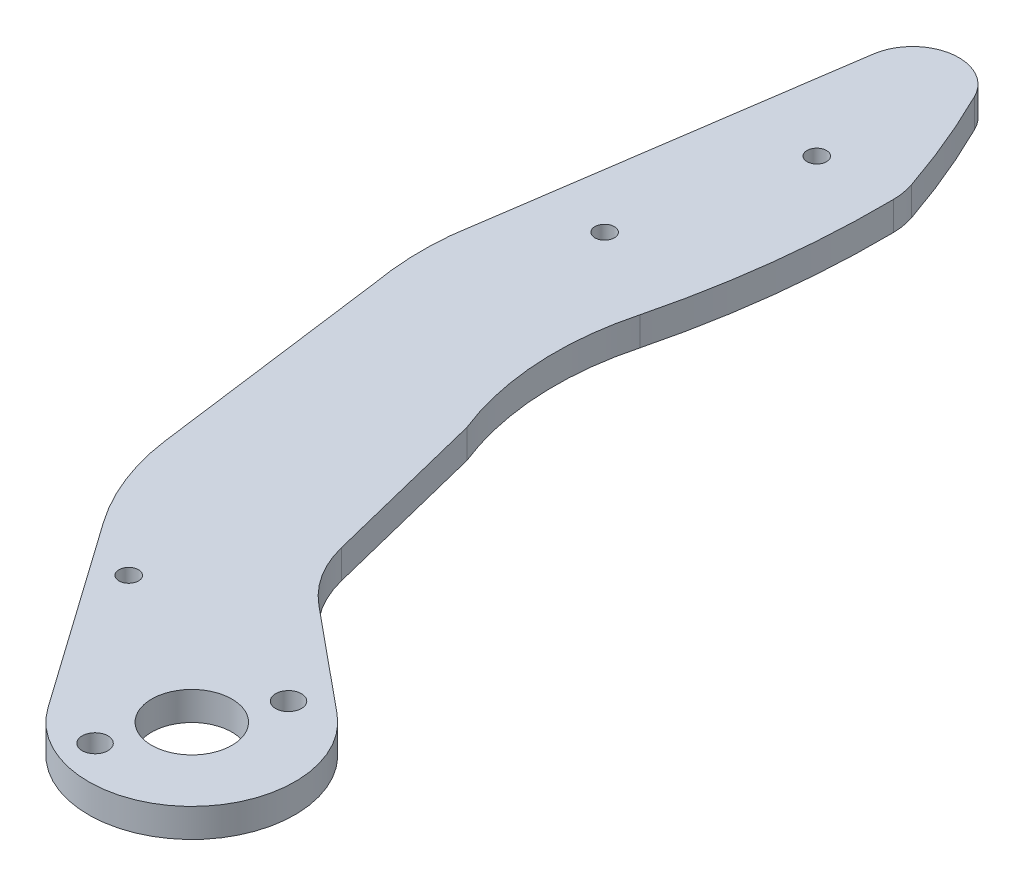
ISO-10303-21;
HEADER;
FILE_DESCRIPTION(('STEP AP214'),'2;1');
FILE_NAME('part.step','',(''),(''),'','','');
FILE_SCHEMA(('AUTOMOTIVE_DESIGN { 1 0 10303 214 1 1 1 1 }'));
ENDSEC;
DATA;
#1=APPLICATION_CONTEXT('core data for automotive mechanical design processes');
#2=APPLICATION_PROTOCOL_DEFINITION('international standard','automotive_design',2000,#1);
#3=PRODUCT_CONTEXT('',#1,'mechanical');
#4=PRODUCT('Part','Part','',(#3));
#5=PRODUCT_RELATED_PRODUCT_CATEGORY('part','',(#4));
#6=PRODUCT_DEFINITION_FORMATION('','',#4);
#7=PRODUCT_DEFINITION_CONTEXT('part definition',#1,'design');
#8=PRODUCT_DEFINITION('design','',#6,#7);
#9=PRODUCT_DEFINITION_SHAPE('','',#8);
#10=(LENGTH_UNIT() NAMED_UNIT(*) SI_UNIT(.MILLI.,.METRE.));
#11=(NAMED_UNIT(*) PLANE_ANGLE_UNIT() SI_UNIT($,.RADIAN.));
#12=(NAMED_UNIT(*) SI_UNIT($,.STERADIAN.) SOLID_ANGLE_UNIT());
#13=UNCERTAINTY_MEASURE_WITH_UNIT(LENGTH_MEASURE(1.E-05),#10,'distance_accuracy_value','');
#14=(GEOMETRIC_REPRESENTATION_CONTEXT(3) GLOBAL_UNCERTAINTY_ASSIGNED_CONTEXT((#13)) GLOBAL_UNIT_ASSIGNED_CONTEXT((#10,
#11,#12)) REPRESENTATION_CONTEXT('',''));
#15=CARTESIAN_POINT('',(0.,0.,0.));
#16=DIRECTION('',(0.,0.,1.));
#17=DIRECTION('',(1.,0.,0.));
#18=AXIS2_PLACEMENT_3D('',#15,#16,#17);
#19=CARTESIAN_POINT('',(0.,5.,0.));
#20=DIRECTION('',(0.,-1.,0.));
#21=DIRECTION('',(0.,0.,-1.));
#22=AXIS2_PLACEMENT_3D('',#19,#20,#21);
#23=PLANE('',#22);
#24=CARTESIAN_POINT('',(-5.25120650732144,5.,11.6184048051987));
#25=DIRECTION('',(0.,1.,0.));
#26=DIRECTION('',(0.,0.,1.));
#27=AXIS2_PLACEMENT_3D('',#24,#25,#26);
#28=CIRCLE('',#27,2.24999999999999);
#29=CARTESIAN_POINT('',(-5.25120650732144,5.,13.8684048051987));
#30=VERTEX_POINT('',#29);
#31=EDGE_CURVE('E312',#30,#30,#28,.T.);
#32=ORIENTED_EDGE('',*,*,#31,.F.);
#33=EDGE_LOOP('',(#32));
#34=FACE_BOUND('',#33,.T.);
#35=CARTESIAN_POINT('',(-31.,5.,-140.));
#36=DIRECTION('',(0.,1.,0.));
#37=DIRECTION('',(0.,0.,1.));
#38=AXIS2_PLACEMENT_3D('',#35,#36,#37);
#39=CIRCLE('',#38,1.7);
#40=CARTESIAN_POINT('',(-31.,5.,-138.3));
#41=VERTEX_POINT('',#40);
#42=EDGE_CURVE('E335',#41,#41,#39,.T.);
#43=ORIENTED_EDGE('',*,*,#42,.F.);
#44=EDGE_LOOP('',(#43));
#45=FACE_BOUND('',#44,.T.);
#46=CARTESIAN_POINT('',(-38.,5.,-110.));
#47=DIRECTION('',(0.,1.,0.));
#48=DIRECTION('',(0.,0.,1.));
#49=AXIS2_PLACEMENT_3D('',#46,#47,#48);
#50=CIRCLE('',#49,1.7);
#51=CARTESIAN_POINT('',(-38.,5.,-108.3));
#52=VERTEX_POINT('',#51);
#53=EDGE_CURVE('E319',#52,#52,#50,.T.);
#54=ORIENTED_EDGE('',*,*,#53,.F.);
#55=EDGE_LOOP('',(#54));
#56=FACE_BOUND('',#55,.T.);
#57=CARTESIAN_POINT('',(0.,5.,0.));
#58=DIRECTION('',(0.,1.,0.));
#59=DIRECTION('',(0.,0.,-1.));
#60=AXIS2_PLACEMENT_3D('',#57,#58,#59);
#61=CIRCLE('',#60,18.);
#62=CARTESIAN_POINT('',(-14.7090417206775,5.,10.3751670665763));
#63=VERTEX_POINT('',#62);
#64=CARTESIAN_POINT('',(11.4464775057828,5.,-13.8916576660098));
#65=VERTEX_POINT('',#64);
#66=EDGE_CURVE('E224',#63,#65,#61,.T.);
#67=ORIENTED_EDGE('',*,*,#66,.T.);
#68=DIRECTION('',(-0.771758759222768,0.,-0.635915416987931));
#69=VECTOR('',#68,1.);
#70=CARTESIAN_POINT('',(11.4464775057828,5.,-13.8916576660098));
#71=LINE('',#70,#69);
#72=CARTESIAN_POINT('',(-6.60695362920451,5.,-28.7673620892809));
#73=VERTEX_POINT('',#72);
#74=EDGE_CURVE('E122',#65,#73,#71,.T.);
#75=ORIENTED_EDGE('',*,*,#74,.T.);
#76=CARTESIAN_POINT('',(6.11135471055411,5.,-44.2025372737363));
#77=DIRECTION('',(0.,-1.,0.));
#78=DIRECTION('',(0.,0.,-1.));
#79=AXIS2_PLACEMENT_3D('',#76,#77,#78);
#80=CIRCLE('',#79,20.);
#81=CARTESIAN_POINT('',(-13.2989437963698,5.,-39.381716609979));
#82=VERTEX_POINT('',#81);
#83=EDGE_CURVE('E270',#73,#82,#80,.T.);
#84=ORIENTED_EDGE('',*,*,#83,.T.);
#85=DIRECTION('',(-0.241041033187863,0.,-0.970514925346193));
#86=VECTOR('',#85,1.);
#87=CARTESIAN_POINT('',(-13.2989437963698,5.,-39.381716609979));
#88=LINE('',#87,#86);
#89=CARTESIAN_POINT('',(-20.5301747920056,5.,-68.4971643703648));
#90=VERTEX_POINT('',#89);
#91=EDGE_CURVE('E290',#82,#90,#88,.T.);
#92=ORIENTED_EDGE('',*,*,#91,.T.);
#93=CARTESIAN_POINT('',(26.9937980567859,5.,-87.4580042567529));
#94=DIRECTION('',(0.,-1.,0.));
#95=DIRECTION('',(0.,0.,1.));
#96=AXIS2_PLACEMENT_3D('',#93,#94,#95);
#97=CIRCLE('',#96,51.1668002178163);
#98=CARTESIAN_POINT('',(-22.4565511628832,5.,-100.599709115054));
#99=VERTEX_POINT('',#98);
#100=EDGE_CURVE('E286',#90,#99,#97,.T.);
#101=ORIENTED_EDGE('',*,*,#100,.T.);
#102=CARTESIAN_POINT('',(-171.2572125516,5.,-138.292363187831));
#103=DIRECTION('',(0.,1.,0.));
#104=DIRECTION('',(0.,0.,1.));
#105=AXIS2_PLACEMENT_3D('',#102,#103,#104);
#106=CIRCLE('',#105,153.500400653449);
#107=CARTESIAN_POINT('',(-17.7680269599981,5.,-140.147870449029));
#108=VERTEX_POINT('',#107);
#109=EDGE_CURVE('E289',#99,#108,#106,.T.);
#110=ORIENTED_EDGE('',*,*,#109,.T.);
#111=CARTESIAN_POINT('',(-30.,5.,-140.));
#112=DIRECTION('',(0.,1.,0.));
#113=DIRECTION('',(0.,0.,1.));
#114=AXIS2_PLACEMENT_3D('',#111,#112,#113);
#115=CIRCLE('',#114,12.2328667989573);
#116=CARTESIAN_POINT('',(-18.4178287610431,5.,-143.93653902718));
#117=VERTEX_POINT('',#116);
#118=EDGE_CURVE('E294',#108,#117,#115,.T.);
#119=ORIENTED_EDGE('',*,*,#118,.T.);
#120=CARTESIAN_POINT('',(-163.753174500954,5.,-94.5400788358876));
#121=DIRECTION('',(0.,1.,0.));
#122=DIRECTION('',(0.,0.,1.));
#123=AXIS2_PLACEMENT_3D('',#120,#121,#122);
#124=CIRCLE('',#123,153.500400653449);
#125=CARTESIAN_POINT('',(-26.2562949035577,5.,-162.782156044517));
#126=VERTEX_POINT('',#125);
#127=EDGE_CURVE('E302',#117,#126,#124,.T.);
#128=ORIENTED_EDGE('',*,*,#127,.T.);
#129=CARTESIAN_POINT('',(-33.4913170526785,5.,-159.191289535021));
#130=DIRECTION('',(0.,1.,0.));
#131=DIRECTION('',(0.,0.,1.));
#132=AXIS2_PLACEMENT_3D('',#129,#130,#131);
#133=CIRCLE('',#132,8.0771200181305);
#134=CARTESIAN_POINT('',(-41.4826176844214,5.,-160.365590178123));
#135=VERTEX_POINT('',#134);
#136=EDGE_CURVE('E305',#126,#135,#133,.T.);
#137=ORIENTED_EDGE('',*,*,#136,.T.);
#138=DIRECTION('',(-0.145386058454699,0.,0.989375001709163));
#139=VECTOR('',#138,1.);
#140=CARTESIAN_POINT('',(-41.4826176844214,5.,-160.365590178123));
#141=LINE('',#140,#139);
#142=CARTESIAN_POINT('',(-50.9327114839769,5.,-96.0562150670269));
#143=VERTEX_POINT('',#142);
#144=EDGE_CURVE('E308',#135,#143,#141,.T.);
#145=ORIENTED_EDGE('',*,*,#144,.T.);
#146=CARTESIAN_POINT('',(0.00716740026227708,5.,-91.2426733575386));
#147=DIRECTION('',(0.,1.,0.));
#148=DIRECTION('',(0.,0.,1.));
#149=AXIS2_PLACEMENT_3D('',#146,#147,#148);
#150=CIRCLE('',#149,51.1668002178164);
#151=CARTESIAN_POINT('',(-50.3834749970696,5.,-82.3643512573803));
#152=VERTEX_POINT('',#151);
#153=EDGE_CURVE('E159',#143,#152,#150,.T.);
#154=ORIENTED_EDGE('',*,*,#153,.T.);
#155=DIRECTION('',(0.130981717678106,0.,0.991384783842325));
#156=VECTOR('',#155,1.);
#157=CARTESIAN_POINT('',(-50.3834749970696,5.,-82.3643512573803));
#158=LINE('',#157,#156);
#159=CARTESIAN_POINT('',(-44.8192942270945,5.,-40.2497397857414));
#160=VERTEX_POINT('',#159);
#161=EDGE_CURVE('E153',#152,#160,#158,.T.);
#162=ORIENTED_EDGE('',*,*,#161,.T.);
#163=CARTESIAN_POINT('',(-5.16390287340153,5.,-45.4890084928656));
#164=DIRECTION('',(0.,1.,0.));
#165=DIRECTION('',(0.,0.,1.));
#166=AXIS2_PLACEMENT_3D('',#163,#164,#165);
#167=CIRCLE('',#166,40.);
#168=CARTESIAN_POINT('',(-37.8506622526848,5.,-22.4330816782516));
#169=VERTEX_POINT('',#168);
#170=EDGE_CURVE('E157',#160,#169,#167,.T.);
#171=ORIENTED_EDGE('',*,*,#170,.T.);
#172=DIRECTION('',(0.576398170365351,0.,0.817168984482081));
#173=VECTOR('',#172,1.);
#174=CARTESIAN_POINT('',(-37.8506622526848,5.,-22.4330816782516));
#175=LINE('',#174,#173);
#176=EDGE_CURVE('E61',#169,#63,#175,.T.);
#177=ORIENTED_EDGE('',*,*,#176,.T.);
#178=EDGE_LOOP('',(#67,#75,#84,#92,#101,#110,#119,#128,#137,#145,#154,#162,#171,#177));
#179=FACE_BOUND('',#178,.T.);
#180=CARTESIAN_POINT('',(0.,5.,0.));
#181=DIRECTION('',(0.,1.,0.));
#182=DIRECTION('',(0.,0.,1.));
#183=AXIS2_PLACEMENT_3D('',#180,#181,#182);
#184=CIRCLE('',#183,7.);
#185=CARTESIAN_POINT('',(0.,5.,7.));
#186=VERTEX_POINT('',#185);
#187=EDGE_CURVE('E188',#186,#186,#184,.T.);
#188=ORIENTED_EDGE('',*,*,#187,.F.);
#189=EDGE_LOOP('',(#188));
#190=FACE_BOUND('',#189,.T.);
#191=CARTESIAN_POINT('',(-27.6732846118374,5.,-16.6790083276029));
#192=DIRECTION('',(0.,1.,0.));
#193=DIRECTION('',(0.,0.,1.));
#194=AXIS2_PLACEMENT_3D('',#191,#192,#193);
#195=CIRCLE('',#194,1.7);
#196=CARTESIAN_POINT('',(-27.6732846118374,5.,-14.9790083276029));
#197=VERTEX_POINT('',#196);
#198=EDGE_CURVE('E347',#197,#197,#195,.T.);
#199=ORIENTED_EDGE('',*,*,#198,.F.);
#200=EDGE_LOOP('',(#199));
#201=FACE_BOUND('',#200,.T.);
#202=CARTESIAN_POINT('',(5.25120650732144,5.,-11.6184048051987));
#203=DIRECTION('',(0.,1.,0.));
#204=DIRECTION('',(0.,0.,1.));
#205=AXIS2_PLACEMENT_3D('',#202,#203,#204);
#206=CIRCLE('',#205,2.24999999999999);
#207=CARTESIAN_POINT('',(5.25120650732144,5.,-9.36840480519874));
#208=VERTEX_POINT('',#207);
#209=EDGE_CURVE('E324',#208,#208,#206,.T.);
#210=ORIENTED_EDGE('',*,*,#209,.F.);
#211=EDGE_LOOP('',(#210));
#212=FACE_BOUND('',#211,.T.);
#213=ADVANCED_FACE('F42',(#34,#45,#56,#179,#190,#201,#212),#23,.F.);
#214=CARTESIAN_POINT('',(0.,0.,0.));
#215=DIRECTION('',(0.,-1.,0.));
#216=DIRECTION('',(0.,0.,-1.));
#217=AXIS2_PLACEMENT_3D('',#214,#215,#216);
#218=PLANE('',#217);
#219=CARTESIAN_POINT('',(-5.25120650732144,0.,11.6184048051987));
#220=DIRECTION('',(0.,-1.,0.));
#221=DIRECTION('',(0.,0.,-1.));
#222=AXIS2_PLACEMENT_3D('',#219,#220,#221);
#223=CIRCLE('',#222,2.24999999999999);
#224=CARTESIAN_POINT('',(-5.25120650732144,0.,9.36840480519874));
#225=VERTEX_POINT('',#224);
#226=EDGE_CURVE('E314',#225,#225,#223,.T.);
#227=ORIENTED_EDGE('',*,*,#226,.F.);
#228=EDGE_LOOP('',(#227));
#229=FACE_BOUND('',#228,.T.);
#230=CARTESIAN_POINT('',(5.25120650732144,0.,-11.6184048051987));
#231=DIRECTION('',(0.,-1.,0.));
#232=DIRECTION('',(0.,0.,-1.));
#233=AXIS2_PLACEMENT_3D('',#230,#231,#232);
#234=CIRCLE('',#233,2.24999999999999);
#235=CARTESIAN_POINT('',(5.25120650732144,0.,-13.8684048051987));
#236=VERTEX_POINT('',#235);
#237=EDGE_CURVE('E46',#236,#236,#234,.T.);
#238=ORIENTED_EDGE('',*,*,#237,.F.);
#239=EDGE_LOOP('',(#238));
#240=FACE_BOUND('',#239,.T.);
#241=CARTESIAN_POINT('',(-31.,0.,-140.));
#242=DIRECTION('',(0.,-1.,0.));
#243=DIRECTION('',(0.,0.,-1.));
#244=AXIS2_PLACEMENT_3D('',#241,#242,#243);
#245=CIRCLE('',#244,1.7);
#246=CARTESIAN_POINT('',(-31.,0.,-141.7));
#247=VERTEX_POINT('',#246);
#248=EDGE_CURVE('E340',#247,#247,#245,.F.);
#249=ORIENTED_EDGE('',*,*,#248,.T.);
#250=EDGE_LOOP('',(#249));
#251=FACE_BOUND('',#250,.T.);
#252=CARTESIAN_POINT('',(-38.,0.,-110.));
#253=DIRECTION('',(0.,-1.,0.));
#254=DIRECTION('',(0.,0.,-1.));
#255=AXIS2_PLACEMENT_3D('',#252,#253,#254);
#256=CIRCLE('',#255,1.7);
#257=CARTESIAN_POINT('',(-38.,0.,-111.7));
#258=VERTEX_POINT('',#257);
#259=EDGE_CURVE('E317',#258,#258,#256,.F.);
#260=ORIENTED_EDGE('',*,*,#259,.T.);
#261=EDGE_LOOP('',(#260));
#262=FACE_BOUND('',#261,.T.);
#263=CARTESIAN_POINT('',(0.,0.,0.));
#264=DIRECTION('',(0.,1.,0.));
#265=DIRECTION('',(0.,0.,1.));
#266=AXIS2_PLACEMENT_3D('',#263,#264,#265);
#267=CIRCLE('',#266,7.);
#268=CARTESIAN_POINT('',(0.,0.,7.));
#269=VERTEX_POINT('',#268);
#270=EDGE_CURVE('E350',#269,#269,#267,.T.);
#271=ORIENTED_EDGE('',*,*,#270,.T.);
#272=EDGE_LOOP('',(#271));
#273=FACE_BOUND('',#272,.T.);
#274=CARTESIAN_POINT('',(0.,0.,0.));
#275=DIRECTION('',(0.,1.,0.));
#276=DIRECTION('',(0.,0.,-1.));
#277=AXIS2_PLACEMENT_3D('',#274,#275,#276);
#278=CIRCLE('',#277,18.);
#279=CARTESIAN_POINT('',(-14.7090417206775,0.,10.3751670665763));
#280=VERTEX_POINT('',#279);
#281=CARTESIAN_POINT('',(11.4464775057828,0.,-13.8916576660098));
#282=VERTEX_POINT('',#281);
#283=EDGE_CURVE('E183',#280,#282,#278,.T.);
#284=ORIENTED_EDGE('',*,*,#283,.F.);
#285=DIRECTION('',(0.576398170365351,0.,0.817168984482081));
#286=VECTOR('',#285,1.);
#287=CARTESIAN_POINT('',(-37.8506622526848,0.,-22.4330816782516));
#288=LINE('',#287,#286);
#289=CARTESIAN_POINT('',(-37.8506622526848,0.,-22.4330816782516));
#290=VERTEX_POINT('',#289);
#291=EDGE_CURVE('E114',#290,#280,#288,.T.);
#292=ORIENTED_EDGE('',*,*,#291,.F.);
#293=CARTESIAN_POINT('',(-5.16390287340153,0.,-45.4890084928656));
#294=DIRECTION('',(0.,1.,0.));
#295=DIRECTION('',(0.,0.,1.));
#296=AXIS2_PLACEMENT_3D('',#293,#294,#295);
#297=CIRCLE('',#296,40.);
#298=CARTESIAN_POINT('',(-44.8192942270945,0.,-40.2497397857414));
#299=VERTEX_POINT('',#298);
#300=EDGE_CURVE('E108',#299,#290,#297,.T.);
#301=ORIENTED_EDGE('',*,*,#300,.F.);
#302=DIRECTION('',(0.130981717678106,0.,0.991384783842325));
#303=VECTOR('',#302,1.);
#304=CARTESIAN_POINT('',(-50.3834749970696,0.,-82.3643512573803));
#305=LINE('',#304,#303);
#306=CARTESIAN_POINT('',(-50.3834749970696,0.,-82.3643512573803));
#307=VERTEX_POINT('',#306);
#308=EDGE_CURVE('E168',#307,#299,#305,.T.);
#309=ORIENTED_EDGE('',*,*,#308,.F.);
#310=CARTESIAN_POINT('',(0.00716740026227708,0.,-91.2426733575386));
#311=DIRECTION('',(0.,1.,0.));
#312=DIRECTION('',(0.,0.,1.));
#313=AXIS2_PLACEMENT_3D('',#310,#311,#312);
#314=CIRCLE('',#313,51.1668002178164);
#315=CARTESIAN_POINT('',(-50.9327114839769,0.,-96.0562150670269));
#316=VERTEX_POINT('',#315);
#317=EDGE_CURVE('E215',#316,#307,#314,.T.);
#318=ORIENTED_EDGE('',*,*,#317,.F.);
#319=DIRECTION('',(-0.145386058454699,0.,0.989375001709163));
#320=VECTOR('',#319,1.);
#321=CARTESIAN_POINT('',(-41.4826176844214,0.,-160.365590178123));
#322=LINE('',#321,#320);
#323=CARTESIAN_POINT('',(-41.4826176844214,0.,-160.365590178123));
#324=VERTEX_POINT('',#323);
#325=EDGE_CURVE('E212',#324,#316,#322,.T.);
#326=ORIENTED_EDGE('',*,*,#325,.F.);
#327=CARTESIAN_POINT('',(-33.4913170526785,0.,-159.191289535021));
#328=DIRECTION('',(0.,1.,0.));
#329=DIRECTION('',(0.,0.,1.));
#330=AXIS2_PLACEMENT_3D('',#327,#328,#329);
#331=CIRCLE('',#330,8.0771200181305);
#332=CARTESIAN_POINT('',(-26.2562949035577,0.,-162.782156044517));
#333=VERTEX_POINT('',#332);
#334=EDGE_CURVE('E209',#333,#324,#331,.T.);
#335=ORIENTED_EDGE('',*,*,#334,.F.);
#336=CARTESIAN_POINT('',(-163.753174500954,0.,-94.5400788358876));
#337=DIRECTION('',(0.,1.,0.));
#338=DIRECTION('',(0.,0.,1.));
#339=AXIS2_PLACEMENT_3D('',#336,#337,#338);
#340=CIRCLE('',#339,153.500400653449);
#341=CARTESIAN_POINT('',(-18.4178287610431,0.,-143.93653902718));
#342=VERTEX_POINT('',#341);
#343=EDGE_CURVE('E206',#342,#333,#340,.T.);
#344=ORIENTED_EDGE('',*,*,#343,.F.);
#345=CARTESIAN_POINT('',(-30.,0.,-140.));
#346=DIRECTION('',(0.,1.,0.));
#347=DIRECTION('',(0.,0.,1.));
#348=AXIS2_PLACEMENT_3D('',#345,#346,#347);
#349=CIRCLE('',#348,12.2328667989573);
#350=CARTESIAN_POINT('',(-17.7680269599981,0.,-140.147870449029));
#351=VERTEX_POINT('',#350);
#352=EDGE_CURVE('E203',#351,#342,#349,.T.);
#353=ORIENTED_EDGE('',*,*,#352,.F.);
#354=CARTESIAN_POINT('',(-171.2572125516,0.,-138.292363187831));
#355=DIRECTION('',(0.,1.,0.));
#356=DIRECTION('',(0.,0.,1.));
#357=AXIS2_PLACEMENT_3D('',#354,#355,#356);
#358=CIRCLE('',#357,153.500400653449);
#359=CARTESIAN_POINT('',(-22.4565511628832,0.,-100.599709115054));
#360=VERTEX_POINT('',#359);
#361=EDGE_CURVE('E200',#360,#351,#358,.T.);
#362=ORIENTED_EDGE('',*,*,#361,.F.);
#363=CARTESIAN_POINT('',(26.9937980567859,0.,-87.4580042567529));
#364=DIRECTION('',(0.,-1.,0.));
#365=DIRECTION('',(0.,0.,1.));
#366=AXIS2_PLACEMENT_3D('',#363,#364,#365);
#367=CIRCLE('',#366,51.1668002178163);
#368=CARTESIAN_POINT('',(-20.5301747920056,0.,-68.4971643703648));
#369=VERTEX_POINT('',#368);
#370=EDGE_CURVE('E197',#369,#360,#367,.T.);
#371=ORIENTED_EDGE('',*,*,#370,.F.);
#372=DIRECTION('',(-0.241041033187863,0.,-0.970514925346193));
#373=VECTOR('',#372,1.);
#374=CARTESIAN_POINT('',(-13.2989437963698,0.,-39.381716609979));
#375=LINE('',#374,#373);
#376=CARTESIAN_POINT('',(-13.2989437963698,0.,-39.381716609979));
#377=VERTEX_POINT('',#376);
#378=EDGE_CURVE('E194',#377,#369,#375,.T.);
#379=ORIENTED_EDGE('',*,*,#378,.F.);
#380=CARTESIAN_POINT('',(6.11135471055411,0.,-44.2025372737363));
#381=DIRECTION('',(0.,-1.,0.));
#382=DIRECTION('',(0.,0.,-1.));
#383=AXIS2_PLACEMENT_3D('',#380,#381,#382);
#384=CIRCLE('',#383,20.);
#385=CARTESIAN_POINT('',(-6.60695362920451,0.,-28.7673620892809));
#386=VERTEX_POINT('',#385);
#387=EDGE_CURVE('E191',#386,#377,#384,.T.);
#388=ORIENTED_EDGE('',*,*,#387,.F.);
#389=DIRECTION('',(-0.771758759222768,0.,-0.635915416987931));
#390=VECTOR('',#389,1.);
#391=CARTESIAN_POINT('',(11.4464775057828,0.,-13.8916576660098));
#392=LINE('',#391,#390);
#393=EDGE_CURVE('E187',#282,#386,#392,.T.);
#394=ORIENTED_EDGE('',*,*,#393,.F.);
#395=EDGE_LOOP('',(#284,#292,#301,#309,#318,#326,#335,#344,#353,#362,#371,#379,#388,#394));
#396=FACE_BOUND('',#395,.T.);
#397=CARTESIAN_POINT('',(-27.6732846118374,0.,-16.6790083276029));
#398=DIRECTION('',(0.,1.,0.));
#399=DIRECTION('',(0.,0.,1.));
#400=AXIS2_PLACEMENT_3D('',#397,#398,#399);
#401=CIRCLE('',#400,1.7);
#402=CARTESIAN_POINT('',(-27.6732846118374,0.,-14.9790083276029));
#403=VERTEX_POINT('',#402);
#404=EDGE_CURVE('E339',#403,#403,#401,.T.);
#405=ORIENTED_EDGE('',*,*,#404,.T.);
#406=EDGE_LOOP('',(#405));
#407=FACE_BOUND('',#406,.T.);
#408=ADVANCED_FACE('F274',(#229,#240,#251,#262,#273,#396,#407),#218,.T.);
#409=CARTESIAN_POINT('',(0.,5.,0.));
#410=DIRECTION('',(0.,-1.,0.));
#411=DIRECTION('',(0.,0.,-1.));
#412=AXIS2_PLACEMENT_3D('',#409,#410,#411);
#413=CYLINDRICAL_SURFACE('',#412,18.);
#414=ORIENTED_EDGE('',*,*,#283,.T.);
#415=DIRECTION('',(0.,-1.,0.));
#416=VECTOR('',#415,1.);
#417=CARTESIAN_POINT('',(11.4464775057828,5.,-13.8916576660098));
#418=LINE('',#417,#416);
#419=EDGE_CURVE('E11',#65,#282,#418,.T.);
#420=ORIENTED_EDGE('',*,*,#419,.F.);
#421=ORIENTED_EDGE('',*,*,#66,.F.);
#422=DIRECTION('',(0.,-1.,0.));
#423=VECTOR('',#422,1.);
#424=CARTESIAN_POINT('',(-14.7090417206775,5.,10.3751670665763));
#425=LINE('',#424,#423);
#426=EDGE_CURVE('E179',#63,#280,#425,.T.);
#427=ORIENTED_EDGE('',*,*,#426,.T.);
#428=EDGE_LOOP('',(#414,#420,#421,#427));
#429=FACE_BOUND('',#428,.T.);
#430=ADVANCED_FACE('F44',(#429),#413,.T.);
#431=CARTESIAN_POINT('',(11.4464775057828,5.,-13.8916576660098));
#432=DIRECTION('',(-0.635915416987931,0.,0.771758759222768));
#433=DIRECTION('',(0.771758759222768,0.,0.635915416987931));
#434=AXIS2_PLACEMENT_3D('',#431,#432,#433);
#435=PLANE('',#434);
#436=ORIENTED_EDGE('',*,*,#393,.T.);
#437=DIRECTION('',(0.,-1.,0.));
#438=VECTOR('',#437,1.);
#439=CARTESIAN_POINT('',(-6.60695362920451,5.,-28.7673620892809));
#440=LINE('',#439,#438);
#441=EDGE_CURVE('E53',#73,#386,#440,.T.);
#442=ORIENTED_EDGE('',*,*,#441,.F.);
#443=ORIENTED_EDGE('',*,*,#74,.F.);
#444=ORIENTED_EDGE('',*,*,#419,.T.);
#445=EDGE_LOOP('',(#436,#442,#443,#444));
#446=FACE_BOUND('',#445,.T.);
#447=ADVANCED_FACE('F363',(#446),#435,.F.);
#448=CARTESIAN_POINT('',(6.11135471055411,5.,-44.2025372737363));
#449=DIRECTION('',(0.,-1.,0.));
#450=DIRECTION('',(0.,0.,-1.));
#451=AXIS2_PLACEMENT_3D('',#448,#449,#450);
#452=CYLINDRICAL_SURFACE('',#451,20.);
#453=ORIENTED_EDGE('',*,*,#387,.T.);
#454=DIRECTION('',(0.,-1.,0.));
#455=VECTOR('',#454,1.);
#456=CARTESIAN_POINT('',(-13.2989437963698,5.,-39.381716609979));
#457=LINE('',#456,#455);
#458=EDGE_CURVE('E258',#82,#377,#457,.T.);
#459=ORIENTED_EDGE('',*,*,#458,.F.);
#460=ORIENTED_EDGE('',*,*,#83,.F.);
#461=ORIENTED_EDGE('',*,*,#441,.T.);
#462=EDGE_LOOP('',(#453,#459,#460,#461));
#463=FACE_BOUND('',#462,.T.);
#464=ADVANCED_FACE('F268',(#463),#452,.F.);
#465=CARTESIAN_POINT('',(-13.2989437963698,5.,-39.381716609979));
#466=DIRECTION('',(-0.970514925346193,0.,0.241041033187863));
#467=DIRECTION('',(0.241041033187863,0.,0.970514925346194));
#468=AXIS2_PLACEMENT_3D('',#465,#466,#467);
#469=PLANE('',#468);
#470=ORIENTED_EDGE('',*,*,#378,.T.);
#471=DIRECTION('',(0.,-1.,0.));
#472=VECTOR('',#471,1.);
#473=CARTESIAN_POINT('',(-20.5301747920056,5.,-68.4971643703648));
#474=LINE('',#473,#472);
#475=EDGE_CURVE('E254',#90,#369,#474,.T.);
#476=ORIENTED_EDGE('',*,*,#475,.F.);
#477=ORIENTED_EDGE('',*,*,#91,.F.);
#478=ORIENTED_EDGE('',*,*,#458,.T.);
#479=EDGE_LOOP('',(#470,#476,#477,#478));
#480=FACE_BOUND('',#479,.T.);
#481=ADVANCED_FACE('F280',(#480),#469,.F.);
#482=CARTESIAN_POINT('',(26.9937980567859,5.,-87.4580042567529));
#483=DIRECTION('',(0.,-1.,0.));
#484=DIRECTION('',(0.,0.,-1.));
#485=AXIS2_PLACEMENT_3D('',#482,#483,#484);
#486=CYLINDRICAL_SURFACE('',#485,51.1668002178163);
#487=ORIENTED_EDGE('',*,*,#370,.T.);
#488=DIRECTION('',(0.,-1.,0.));
#489=VECTOR('',#488,1.);
#490=CARTESIAN_POINT('',(-22.4565511628832,5.,-100.599709115054));
#491=LINE('',#490,#489);
#492=EDGE_CURVE('E250',#99,#360,#491,.T.);
#493=ORIENTED_EDGE('',*,*,#492,.F.);
#494=ORIENTED_EDGE('',*,*,#100,.F.);
#495=ORIENTED_EDGE('',*,*,#475,.T.);
#496=EDGE_LOOP('',(#487,#493,#494,#495));
#497=FACE_BOUND('',#496,.T.);
#498=ADVANCED_FACE('F284',(#497),#486,.F.);
#499=CARTESIAN_POINT('',(-171.2572125516,5.,-138.292363187831));
#500=DIRECTION('',(0.,-1.,0.));
#501=DIRECTION('',(0.,0.,-1.));
#502=AXIS2_PLACEMENT_3D('',#499,#500,#501);
#503=CYLINDRICAL_SURFACE('',#502,153.500400653449);
#504=ORIENTED_EDGE('',*,*,#361,.T.);
#505=DIRECTION('',(0.,-1.,0.));
#506=VECTOR('',#505,1.);
#507=CARTESIAN_POINT('',(-17.7680269599981,5.,-140.147870449029));
#508=LINE('',#507,#506);
#509=EDGE_CURVE('E246',#108,#351,#508,.T.);
#510=ORIENTED_EDGE('',*,*,#509,.F.);
#511=ORIENTED_EDGE('',*,*,#109,.F.);
#512=ORIENTED_EDGE('',*,*,#492,.T.);
#513=EDGE_LOOP('',(#504,#510,#511,#512));
#514=FACE_BOUND('',#513,.T.);
#515=ADVANCED_FACE('F410',(#514),#503,.T.);
#516=CARTESIAN_POINT('',(-30.,5.,-140.));
#517=DIRECTION('',(0.,-1.,0.));
#518=DIRECTION('',(0.,0.,-1.));
#519=AXIS2_PLACEMENT_3D('',#516,#517,#518);
#520=CYLINDRICAL_SURFACE('',#519,12.2328667989573);
#521=ORIENTED_EDGE('',*,*,#352,.T.);
#522=DIRECTION('',(0.,-1.,0.));
#523=VECTOR('',#522,1.);
#524=CARTESIAN_POINT('',(-18.4178287610431,5.,-143.93653902718));
#525=LINE('',#524,#523);
#526=EDGE_CURVE('E242',#117,#342,#525,.T.);
#527=ORIENTED_EDGE('',*,*,#526,.F.);
#528=ORIENTED_EDGE('',*,*,#118,.F.);
#529=ORIENTED_EDGE('',*,*,#509,.T.);
#530=EDGE_LOOP('',(#521,#527,#528,#529));
#531=FACE_BOUND('',#530,.T.);
#532=ADVANCED_FACE('F406',(#531),#520,.T.);
#533=CARTESIAN_POINT('',(-163.753174500954,5.,-94.5400788358876));
#534=DIRECTION('',(0.,-1.,0.));
#535=DIRECTION('',(0.,0.,-1.));
#536=AXIS2_PLACEMENT_3D('',#533,#534,#535);
#537=CYLINDRICAL_SURFACE('',#536,153.500400653449);
#538=ORIENTED_EDGE('',*,*,#343,.T.);
#539=DIRECTION('',(0.,-1.,0.));
#540=VECTOR('',#539,1.);
#541=CARTESIAN_POINT('',(-26.2562949035577,5.,-162.782156044517));
#542=LINE('',#541,#540);
#543=EDGE_CURVE('E238',#126,#333,#542,.T.);
#544=ORIENTED_EDGE('',*,*,#543,.F.);
#545=ORIENTED_EDGE('',*,*,#127,.F.);
#546=ORIENTED_EDGE('',*,*,#526,.T.);
#547=EDGE_LOOP('',(#538,#544,#545,#546));
#548=FACE_BOUND('',#547,.T.);
#549=ADVANCED_FACE('F402',(#548),#537,.T.);
#550=CARTESIAN_POINT('',(-33.4913170526785,5.,-159.191289535021));
#551=DIRECTION('',(0.,-1.,0.));
#552=DIRECTION('',(0.,0.,-1.));
#553=AXIS2_PLACEMENT_3D('',#550,#551,#552);
#554=CYLINDRICAL_SURFACE('',#553,8.0771200181305);
#555=ORIENTED_EDGE('',*,*,#334,.T.);
#556=DIRECTION('',(0.,-1.,0.));
#557=VECTOR('',#556,1.);
#558=CARTESIAN_POINT('',(-41.4826176844214,5.,-160.365590178123));
#559=LINE('',#558,#557);
#560=EDGE_CURVE('E235',#135,#324,#559,.T.);
#561=ORIENTED_EDGE('',*,*,#560,.F.);
#562=ORIENTED_EDGE('',*,*,#136,.F.);
#563=ORIENTED_EDGE('',*,*,#543,.T.);
#564=EDGE_LOOP('',(#555,#561,#562,#563));
#565=FACE_BOUND('',#564,.T.);
#566=ADVANCED_FACE('F398',(#565),#554,.T.);
#567=CARTESIAN_POINT('',(-41.4826176844214,5.,-160.365590178123));
#568=DIRECTION('',(0.989375001709163,0.,0.145386058454699));
#569=DIRECTION('',(0.145386058454699,0.,-0.989375001709163));
#570=AXIS2_PLACEMENT_3D('',#567,#568,#569);
#571=PLANE('',#570);
#572=ORIENTED_EDGE('',*,*,#325,.T.);
#573=DIRECTION('',(0.,-1.,0.));
#574=VECTOR('',#573,1.);
#575=CARTESIAN_POINT('',(-50.9327114839769,5.,-96.0562150670269));
#576=LINE('',#575,#574);
#577=EDGE_CURVE('E231',#143,#316,#576,.T.);
#578=ORIENTED_EDGE('',*,*,#577,.F.);
#579=ORIENTED_EDGE('',*,*,#144,.F.);
#580=ORIENTED_EDGE('',*,*,#560,.T.);
#581=EDGE_LOOP('',(#572,#578,#579,#580));
#582=FACE_BOUND('',#581,.T.);
#583=ADVANCED_FACE('F394',(#582),#571,.F.);
#584=CARTESIAN_POINT('',(0.00716740026227708,5.,-91.2426733575386));
#585=DIRECTION('',(0.,-1.,0.));
#586=DIRECTION('',(0.,0.,-1.));
#587=AXIS2_PLACEMENT_3D('',#584,#585,#586);
#588=CYLINDRICAL_SURFACE('',#587,51.1668002178164);
#589=ORIENTED_EDGE('',*,*,#317,.T.);
#590=DIRECTION('',(0.,-1.,0.));
#591=VECTOR('',#590,1.);
#592=CARTESIAN_POINT('',(-50.3834749970696,5.,-82.3643512573803));
#593=LINE('',#592,#591);
#594=EDGE_CURVE('E170',#152,#307,#593,.T.);
#595=ORIENTED_EDGE('',*,*,#594,.F.);
#596=ORIENTED_EDGE('',*,*,#153,.F.);
#597=ORIENTED_EDGE('',*,*,#577,.T.);
#598=EDGE_LOOP('',(#589,#595,#596,#597));
#599=FACE_BOUND('',#598,.T.);
#600=ADVANCED_FACE('F391',(#599),#588,.T.);
#601=CARTESIAN_POINT('',(-50.3834749970696,5.,-82.3643512573803));
#602=DIRECTION('',(0.991384783842325,0.,-0.130981717678106));
#603=DIRECTION('',(-0.130981717678106,0.,-0.991384783842325));
#604=AXIS2_PLACEMENT_3D('',#601,#602,#603);
#605=PLANE('',#604);
#606=ORIENTED_EDGE('',*,*,#308,.T.);
#607=DIRECTION('',(0.,-1.,0.));
#608=VECTOR('',#607,1.);
#609=CARTESIAN_POINT('',(-44.8192942270945,5.,-40.2497397857414));
#610=LINE('',#609,#608);
#611=EDGE_CURVE('E165',#160,#299,#610,.T.);
#612=ORIENTED_EDGE('',*,*,#611,.F.);
#613=ORIENTED_EDGE('',*,*,#161,.F.);
#614=ORIENTED_EDGE('',*,*,#594,.T.);
#615=EDGE_LOOP('',(#606,#612,#613,#614));
#616=FACE_BOUND('',#615,.T.);
#617=ADVANCED_FACE('F166',(#616),#605,.F.);
#618=CARTESIAN_POINT('',(-5.16390287340153,5.,-45.4890084928656));
#619=DIRECTION('',(0.,-1.,0.));
#620=DIRECTION('',(0.,0.,-1.));
#621=AXIS2_PLACEMENT_3D('',#618,#619,#620);
#622=CYLINDRICAL_SURFACE('',#621,40.);
#623=ORIENTED_EDGE('',*,*,#300,.T.);
#624=DIRECTION('',(0.,-1.,0.));
#625=VECTOR('',#624,1.);
#626=CARTESIAN_POINT('',(-37.8506622526848,5.,-22.4330816782516));
#627=LINE('',#626,#625);
#628=EDGE_CURVE('E171',#169,#290,#627,.T.);
#629=ORIENTED_EDGE('',*,*,#628,.F.);
#630=ORIENTED_EDGE('',*,*,#170,.F.);
#631=ORIENTED_EDGE('',*,*,#611,.T.);
#632=EDGE_LOOP('',(#623,#629,#630,#631));
#633=FACE_BOUND('',#632,.T.);
#634=ADVANCED_FACE('F173',(#633),#622,.T.);
#635=CARTESIAN_POINT('',(-37.8506622526848,5.,-22.4330816782516));
#636=DIRECTION('',(0.817168984482081,0.,-0.576398170365351));
#637=DIRECTION('',(-0.576398170365351,0.,-0.817168984482081));
#638=AXIS2_PLACEMENT_3D('',#635,#636,#637);
#639=PLANE('',#638);
#640=ORIENTED_EDGE('',*,*,#291,.T.);
#641=ORIENTED_EDGE('',*,*,#426,.F.);
#642=ORIENTED_EDGE('',*,*,#176,.F.);
#643=ORIENTED_EDGE('',*,*,#628,.T.);
#644=EDGE_LOOP('',(#640,#641,#642,#643));
#645=FACE_BOUND('',#644,.T.);
#646=ADVANCED_FACE('F384',(#645),#639,.F.);
#647=CARTESIAN_POINT('',(0.,5.,0.));
#648=DIRECTION('',(0.,-1.,0.));
#649=DIRECTION('',(0.,0.,-1.));
#650=AXIS2_PLACEMENT_3D('',#647,#648,#649);
#651=CYLINDRICAL_SURFACE('',#650,7.);
#652=ORIENTED_EDGE('',*,*,#187,.T.);
#653=EDGE_LOOP('',(#652));
#654=FACE_BOUND('',#653,.T.);
#655=ORIENTED_EDGE('',*,*,#270,.F.);
#656=EDGE_LOOP('',(#655));
#657=FACE_BOUND('',#656,.T.);
#658=ADVANCED_FACE('F381',(#654,#657),#651,.F.);
#659=CARTESIAN_POINT('',(-27.6732846118374,5.,-16.6790083276029));
#660=DIRECTION('',(0.,-1.,0.));
#661=DIRECTION('',(0.,0.,-1.));
#662=AXIS2_PLACEMENT_3D('',#659,#660,#661);
#663=CYLINDRICAL_SURFACE('',#662,1.7);
#664=ORIENTED_EDGE('',*,*,#198,.T.);
#665=EDGE_LOOP('',(#664));
#666=FACE_BOUND('',#665,.T.);
#667=ORIENTED_EDGE('',*,*,#404,.F.);
#668=EDGE_LOOP('',(#667));
#669=FACE_BOUND('',#668,.T.);
#670=ADVANCED_FACE('F457',(#666,#669),#663,.F.);
#671=CARTESIAN_POINT('',(-38.,-0.00100000000000013,-110.));
#672=DIRECTION('',(0.,1.,0.));
#673=DIRECTION('',(0.,0.,1.));
#674=AXIS2_PLACEMENT_3D('',#671,#672,#673);
#675=CYLINDRICAL_SURFACE('',#674,1.7);
#676=ORIENTED_EDGE('',*,*,#259,.F.);
#677=EDGE_LOOP('',(#676));
#678=FACE_BOUND('',#677,.T.);
#679=ORIENTED_EDGE('',*,*,#53,.T.);
#680=EDGE_LOOP('',(#679));
#681=FACE_BOUND('',#680,.T.);
#682=ADVANCED_FACE('F463',(#678,#681),#675,.F.);
#683=CARTESIAN_POINT('',(-31.,-0.00100000000000013,-140.));
#684=DIRECTION('',(0.,1.,0.));
#685=DIRECTION('',(0.,0.,1.));
#686=AXIS2_PLACEMENT_3D('',#683,#684,#685);
#687=CYLINDRICAL_SURFACE('',#686,1.7);
#688=ORIENTED_EDGE('',*,*,#248,.F.);
#689=EDGE_LOOP('',(#688));
#690=FACE_BOUND('',#689,.T.);
#691=ORIENTED_EDGE('',*,*,#42,.T.);
#692=EDGE_LOOP('',(#691));
#693=FACE_BOUND('',#692,.T.);
#694=ADVANCED_FACE('F469',(#690,#693),#687,.F.);
#695=CARTESIAN_POINT('',(5.25120650732144,5.,-11.6184048051987));
#696=DIRECTION('',(0.,1.,0.));
#697=DIRECTION('',(0.,0.,1.));
#698=AXIS2_PLACEMENT_3D('',#695,#696,#697);
#699=CYLINDRICAL_SURFACE('',#698,2.24999999999999);
#700=ORIENTED_EDGE('',*,*,#237,.T.);
#701=EDGE_LOOP('',(#700));
#702=FACE_BOUND('',#701,.T.);
#703=ORIENTED_EDGE('',*,*,#209,.T.);
#704=EDGE_LOOP('',(#703));
#705=FACE_BOUND('',#704,.T.);
#706=ADVANCED_FACE('F476',(#702,#705),#699,.F.);
#707=CARTESIAN_POINT('',(-5.25120650732144,5.,11.6184048051987));
#708=DIRECTION('',(0.,1.,0.));
#709=DIRECTION('',(0.,0.,1.));
#710=AXIS2_PLACEMENT_3D('',#707,#708,#709);
#711=CYLINDRICAL_SURFACE('',#710,2.24999999999999);
#712=ORIENTED_EDGE('',*,*,#226,.T.);
#713=EDGE_LOOP('',(#712));
#714=FACE_BOUND('',#713,.T.);
#715=ORIENTED_EDGE('',*,*,#31,.T.);
#716=EDGE_LOOP('',(#715));
#717=FACE_BOUND('',#716,.T.);
#718=ADVANCED_FACE('F483',(#714,#717),#711,.F.);
#719=CLOSED_SHELL('',(#213,#408,#430,#447,#464,#481,#498,#515,#532,#549,#566,#583,#600,#617,
#634,#646,#658,#670,#682,#694,#706,#718));
#720=MANIFOLD_SOLID_BREP('B2',#719);
#721=ADVANCED_BREP_SHAPE_REPRESENTATION('',(#18,#720),#14);
#722=SHAPE_DEFINITION_REPRESENTATION(#9,#721);
ENDSEC;
END-ISO-10303-21;
